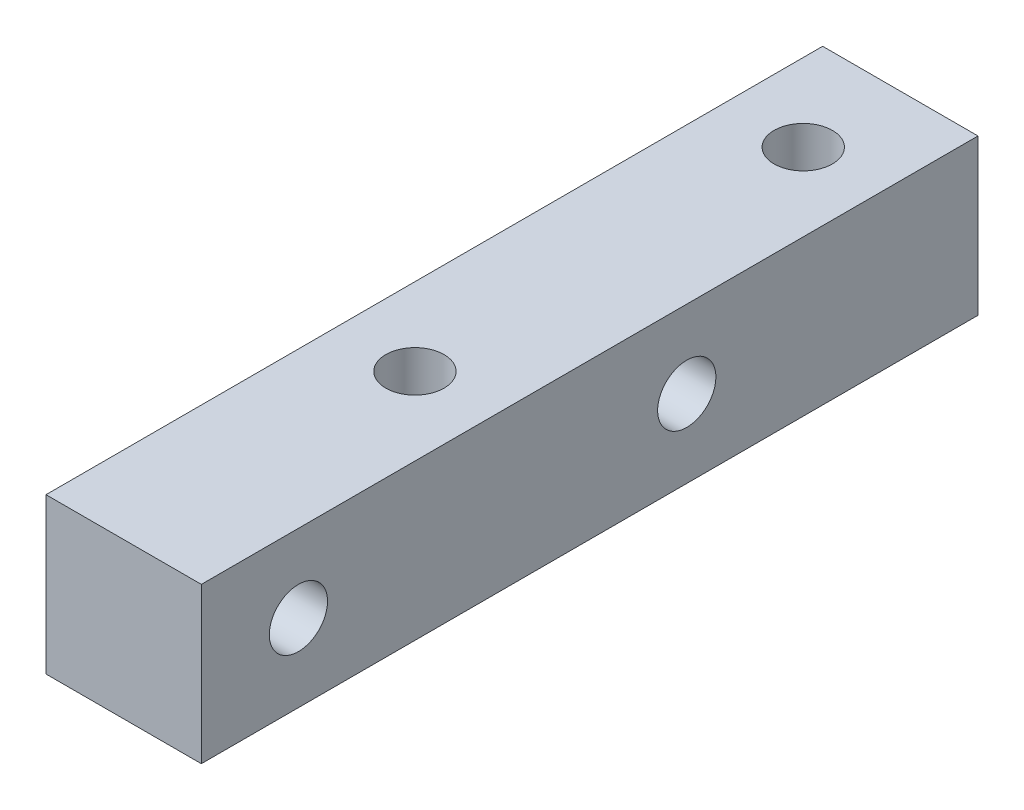
ISO-10303-21;
HEADER;
FILE_DESCRIPTION(('STEP AP214'),'2;1');
FILE_NAME('part.step','',(''),(''),'','','');
FILE_SCHEMA(('AUTOMOTIVE_DESIGN { 1 0 10303 214 1 1 1 1 }'));
ENDSEC;
DATA;
#1=APPLICATION_CONTEXT('core data for automotive mechanical design processes');
#2=APPLICATION_PROTOCOL_DEFINITION('international standard','automotive_design',2000,#1);
#3=PRODUCT_CONTEXT('',#1,'mechanical');
#4=PRODUCT('Part','Part','',(#3));
#5=PRODUCT_RELATED_PRODUCT_CATEGORY('part','',(#4));
#6=PRODUCT_DEFINITION_FORMATION('','',#4);
#7=PRODUCT_DEFINITION_CONTEXT('part definition',#1,'design');
#8=PRODUCT_DEFINITION('design','',#6,#7);
#9=PRODUCT_DEFINITION_SHAPE('','',#8);
#10=(LENGTH_UNIT() NAMED_UNIT(*) SI_UNIT(.MILLI.,.METRE.));
#11=(NAMED_UNIT(*) PLANE_ANGLE_UNIT() SI_UNIT($,.RADIAN.));
#12=(NAMED_UNIT(*) SI_UNIT($,.STERADIAN.) SOLID_ANGLE_UNIT());
#13=UNCERTAINTY_MEASURE_WITH_UNIT(LENGTH_MEASURE(1.E-05),#10,'distance_accuracy_value','');
#14=(GEOMETRIC_REPRESENTATION_CONTEXT(3) GLOBAL_UNCERTAINTY_ASSIGNED_CONTEXT((#13)) GLOBAL_UNIT_ASSIGNED_CONTEXT((#10,
#11,#12)) REPRESENTATION_CONTEXT('',''));
#15=CARTESIAN_POINT('',(0.,0.,0.));
#16=DIRECTION('',(0.,0.,1.));
#17=DIRECTION('',(1.,0.,0.));
#18=AXIS2_PLACEMENT_3D('',#15,#16,#17);
#19=CARTESIAN_POINT('',(4.,4.,20.));
#20=DIRECTION('',(-1.,0.,0.));
#21=DIRECTION('',(0.,-1.,0.));
#22=AXIS2_PLACEMENT_3D('',#19,#20,#21);
#23=PLANE('',#22);
#24=CARTESIAN_POINT('',(4.,0.,15.));
#25=DIRECTION('',(1.,0.,0.));
#26=DIRECTION('',(0.,1.,0.));
#27=AXIS2_PLACEMENT_3D('',#24,#25,#26);
#28=CIRCLE('',#27,1.5);
#29=CARTESIAN_POINT('',(4.,1.5,15.));
#30=VERTEX_POINT('',#29);
#31=EDGE_CURVE('E121',#30,#30,#28,.T.);
#32=ORIENTED_EDGE('',*,*,#31,.F.);
#33=EDGE_LOOP('',(#32));
#34=FACE_BOUND('',#33,.T.);
#35=CARTESIAN_POINT('',(4.,0.,-5.));
#36=DIRECTION('',(1.,0.,0.));
#37=DIRECTION('',(0.,1.,0.));
#38=AXIS2_PLACEMENT_3D('',#35,#36,#37);
#39=CIRCLE('',#38,1.5);
#40=CARTESIAN_POINT('',(4.,1.5,-5.));
#41=VERTEX_POINT('',#40);
#42=EDGE_CURVE('E122',#41,#41,#39,.T.);
#43=ORIENTED_EDGE('',*,*,#42,.F.);
#44=EDGE_LOOP('',(#43));
#45=FACE_BOUND('',#44,.T.);
#46=DIRECTION('',(0.,1.,0.));
#47=VECTOR('',#46,1.);
#48=CARTESIAN_POINT('',(4.,4.,-20.));
#49=LINE('',#48,#47);
#50=CARTESIAN_POINT('',(4.,-4.,-20.));
#51=VERTEX_POINT('',#50);
#52=CARTESIAN_POINT('',(4.,4.,-20.));
#53=VERTEX_POINT('',#52);
#54=EDGE_CURVE('E104',#51,#53,#49,.T.);
#55=ORIENTED_EDGE('',*,*,#54,.T.);
#56=DIRECTION('',(0.,0.,-1.));
#57=VECTOR('',#56,1.);
#58=CARTESIAN_POINT('',(4.,4.,20.));
#59=LINE('',#58,#57);
#60=CARTESIAN_POINT('',(4.,4.,20.));
#61=VERTEX_POINT('',#60);
#62=EDGE_CURVE('E11',#61,#53,#59,.T.);
#63=ORIENTED_EDGE('',*,*,#62,.F.);
#64=DIRECTION('',(0.,1.,0.));
#65=VECTOR('',#64,1.);
#66=CARTESIAN_POINT('',(4.,4.,20.));
#67=LINE('',#66,#65);
#68=CARTESIAN_POINT('',(4.,-4.,20.));
#69=VERTEX_POINT('',#68);
#70=EDGE_CURVE('E92',#69,#61,#67,.T.);
#71=ORIENTED_EDGE('',*,*,#70,.F.);
#72=DIRECTION('',(0.,0.,-1.));
#73=VECTOR('',#72,1.);
#74=CARTESIAN_POINT('',(4.,-4.,20.));
#75=LINE('',#74,#73);
#76=EDGE_CURVE('E100',#69,#51,#75,.T.);
#77=ORIENTED_EDGE('',*,*,#76,.T.);
#78=EDGE_LOOP('',(#55,#63,#71,#77));
#79=FACE_BOUND('',#78,.T.);
#80=ADVANCED_FACE('F41',(#34,#45,#79),#23,.F.);
#81=CARTESIAN_POINT('',(-4.,4.,20.));
#82=DIRECTION('',(0.,-1.,0.));
#83=DIRECTION('',(0.,0.,-1.));
#84=AXIS2_PLACEMENT_3D('',#81,#82,#83);
#85=PLANE('',#84);
#86=CARTESIAN_POINT('',(0.,4.,-15.));
#87=DIRECTION('',(0.,1.,0.));
#88=DIRECTION('',(0.,0.,1.));
#89=AXIS2_PLACEMENT_3D('',#86,#87,#88);
#90=CIRCLE('',#89,1.5);
#91=CARTESIAN_POINT('',(0.,4.,-13.5));
#92=VERTEX_POINT('',#91);
#93=EDGE_CURVE('E133',#92,#92,#90,.T.);
#94=ORIENTED_EDGE('',*,*,#93,.F.);
#95=EDGE_LOOP('',(#94));
#96=FACE_BOUND('',#95,.T.);
#97=CARTESIAN_POINT('',(0.,4.,5.));
#98=DIRECTION('',(0.,1.,0.));
#99=DIRECTION('',(0.,0.,1.));
#100=AXIS2_PLACEMENT_3D('',#97,#98,#99);
#101=CIRCLE('',#100,1.5);
#102=CARTESIAN_POINT('',(0.,4.,6.5));
#103=VERTEX_POINT('',#102);
#104=EDGE_CURVE('E134',#103,#103,#101,.T.);
#105=ORIENTED_EDGE('',*,*,#104,.F.);
#106=EDGE_LOOP('',(#105));
#107=FACE_BOUND('',#106,.T.);
#108=DIRECTION('',(-1.,0.,0.));
#109=VECTOR('',#108,1.);
#110=CARTESIAN_POINT('',(-4.,4.,-20.));
#111=LINE('',#110,#109);
#112=CARTESIAN_POINT('',(-4.,4.,-20.));
#113=VERTEX_POINT('',#112);
#114=EDGE_CURVE('E96',#53,#113,#111,.T.);
#115=ORIENTED_EDGE('',*,*,#114,.T.);
#116=DIRECTION('',(0.,0.,-1.));
#117=VECTOR('',#116,1.);
#118=CARTESIAN_POINT('',(-4.,4.,20.));
#119=LINE('',#118,#117);
#120=CARTESIAN_POINT('',(-4.,4.,20.));
#121=VERTEX_POINT('',#120);
#122=EDGE_CURVE('E49',#121,#113,#119,.T.);
#123=ORIENTED_EDGE('',*,*,#122,.F.);
#124=DIRECTION('',(-1.,0.,0.));
#125=VECTOR('',#124,1.);
#126=CARTESIAN_POINT('',(-4.,4.,20.));
#127=LINE('',#126,#125);
#128=EDGE_CURVE('E87',#61,#121,#127,.T.);
#129=ORIENTED_EDGE('',*,*,#128,.F.);
#130=ORIENTED_EDGE('',*,*,#62,.T.);
#131=EDGE_LOOP('',(#115,#123,#129,#130));
#132=FACE_BOUND('',#131,.T.);
#133=ADVANCED_FACE('F95',(#96,#107,#132),#85,.F.);
#134=CARTESIAN_POINT('',(-4.,4.,20.));
#135=DIRECTION('',(1.,0.,0.));
#136=DIRECTION('',(0.,1.,0.));
#137=AXIS2_PLACEMENT_3D('',#134,#135,#136);
#138=PLANE('',#137);
#139=CARTESIAN_POINT('',(-4.,0.,15.));
#140=DIRECTION('',(1.,0.,0.));
#141=DIRECTION('',(0.,1.,0.));
#142=AXIS2_PLACEMENT_3D('',#139,#140,#141);
#143=CIRCLE('',#142,1.5);
#144=CARTESIAN_POINT('',(-4.,1.5,15.));
#145=VERTEX_POINT('',#144);
#146=EDGE_CURVE('E107',#145,#145,#143,.F.);
#147=ORIENTED_EDGE('',*,*,#146,.F.);
#148=EDGE_LOOP('',(#147));
#149=FACE_BOUND('',#148,.T.);
#150=CARTESIAN_POINT('',(-4.,0.,-5.));
#151=DIRECTION('',(1.,0.,0.));
#152=DIRECTION('',(0.,1.,0.));
#153=AXIS2_PLACEMENT_3D('',#150,#151,#152);
#154=CIRCLE('',#153,1.5);
#155=CARTESIAN_POINT('',(-4.,1.5,-5.));
#156=VERTEX_POINT('',#155);
#157=EDGE_CURVE('E118',#156,#156,#154,.F.);
#158=ORIENTED_EDGE('',*,*,#157,.F.);
#159=EDGE_LOOP('',(#158));
#160=FACE_BOUND('',#159,.T.);
#161=DIRECTION('',(0.,-1.,0.));
#162=VECTOR('',#161,1.);
#163=CARTESIAN_POINT('',(-4.,4.,-20.));
#164=LINE('',#163,#162);
#165=CARTESIAN_POINT('',(-4.,-4.,-20.));
#166=VERTEX_POINT('',#165);
#167=EDGE_CURVE('E74',#113,#166,#164,.T.);
#168=ORIENTED_EDGE('',*,*,#167,.T.);
#169=DIRECTION('',(0.,0.,-1.));
#170=VECTOR('',#169,1.);
#171=CARTESIAN_POINT('',(-4.,-4.,20.));
#172=LINE('',#171,#170);
#173=CARTESIAN_POINT('',(-4.,-4.,20.));
#174=VERTEX_POINT('',#173);
#175=EDGE_CURVE('E97',#174,#166,#172,.T.);
#176=ORIENTED_EDGE('',*,*,#175,.F.);
#177=DIRECTION('',(0.,-1.,0.));
#178=VECTOR('',#177,1.);
#179=CARTESIAN_POINT('',(-4.,4.,20.));
#180=LINE('',#179,#178);
#181=EDGE_CURVE('E90',#121,#174,#180,.T.);
#182=ORIENTED_EDGE('',*,*,#181,.F.);
#183=ORIENTED_EDGE('',*,*,#122,.T.);
#184=EDGE_LOOP('',(#168,#176,#182,#183));
#185=FACE_BOUND('',#184,.T.);
#186=ADVANCED_FACE('F98',(#149,#160,#185),#138,.F.);
#187=CARTESIAN_POINT('',(-4.,-4.,20.));
#188=DIRECTION('',(0.,1.,0.));
#189=DIRECTION('',(0.,0.,1.));
#190=AXIS2_PLACEMENT_3D('',#187,#188,#189);
#191=PLANE('',#190);
#192=CARTESIAN_POINT('',(0.,-4.,-15.));
#193=DIRECTION('',(0.,1.,0.));
#194=DIRECTION('',(0.,0.,1.));
#195=AXIS2_PLACEMENT_3D('',#192,#193,#194);
#196=CIRCLE('',#195,1.5);
#197=CARTESIAN_POINT('',(0.,-4.,-13.5));
#198=VERTEX_POINT('',#197);
#199=EDGE_CURVE('E125',#198,#198,#196,.F.);
#200=ORIENTED_EDGE('',*,*,#199,.F.);
#201=EDGE_LOOP('',(#200));
#202=FACE_BOUND('',#201,.T.);
#203=CARTESIAN_POINT('',(0.,-4.,5.));
#204=DIRECTION('',(0.,1.,0.));
#205=DIRECTION('',(0.,0.,1.));
#206=AXIS2_PLACEMENT_3D('',#203,#204,#205);
#207=CIRCLE('',#206,1.5);
#208=CARTESIAN_POINT('',(0.,-4.,6.5));
#209=VERTEX_POINT('',#208);
#210=EDGE_CURVE('E130',#209,#209,#207,.F.);
#211=ORIENTED_EDGE('',*,*,#210,.F.);
#212=EDGE_LOOP('',(#211));
#213=FACE_BOUND('',#212,.T.);
#214=DIRECTION('',(1.,0.,0.));
#215=VECTOR('',#214,1.);
#216=CARTESIAN_POINT('',(-4.,-4.,-20.));
#217=LINE('',#216,#215);
#218=EDGE_CURVE('E80',#166,#51,#217,.T.);
#219=ORIENTED_EDGE('',*,*,#218,.T.);
#220=ORIENTED_EDGE('',*,*,#76,.F.);
#221=DIRECTION('',(1.,0.,0.));
#222=VECTOR('',#221,1.);
#223=CARTESIAN_POINT('',(-4.,-4.,20.));
#224=LINE('',#223,#222);
#225=EDGE_CURVE('E57',#174,#69,#224,.T.);
#226=ORIENTED_EDGE('',*,*,#225,.F.);
#227=ORIENTED_EDGE('',*,*,#175,.T.);
#228=EDGE_LOOP('',(#219,#220,#226,#227));
#229=FACE_BOUND('',#228,.T.);
#230=ADVANCED_FACE('F112',(#202,#213,#229),#191,.F.);
#231=CARTESIAN_POINT('',(0.,0.,20.));
#232=DIRECTION('',(0.,0.,1.));
#233=DIRECTION('',(1.,0.,0.));
#234=AXIS2_PLACEMENT_3D('',#231,#232,#233);
#235=PLANE('',#234);
#236=ORIENTED_EDGE('',*,*,#70,.T.);
#237=ORIENTED_EDGE('',*,*,#128,.T.);
#238=ORIENTED_EDGE('',*,*,#181,.T.);
#239=ORIENTED_EDGE('',*,*,#225,.T.);
#240=EDGE_LOOP('',(#236,#237,#238,#239));
#241=FACE_BOUND('',#240,.T.);
#242=ADVANCED_FACE('F88',(#241),#235,.T.);
#243=CARTESIAN_POINT('',(0.,0.,-20.));
#244=DIRECTION('',(0.,0.,1.));
#245=DIRECTION('',(1.,0.,0.));
#246=AXIS2_PLACEMENT_3D('',#243,#244,#245);
#247=PLANE('',#246);
#248=ORIENTED_EDGE('',*,*,#54,.F.);
#249=ORIENTED_EDGE('',*,*,#218,.F.);
#250=ORIENTED_EDGE('',*,*,#167,.F.);
#251=ORIENTED_EDGE('',*,*,#114,.F.);
#252=EDGE_LOOP('',(#248,#249,#250,#251));
#253=FACE_BOUND('',#252,.T.);
#254=ADVANCED_FACE('F115',(#253),#247,.F.);
#255=CARTESIAN_POINT('',(-4.001,0.,-5.));
#256=DIRECTION('',(1.,0.,0.));
#257=DIRECTION('',(0.,1.,0.));
#258=AXIS2_PLACEMENT_3D('',#255,#256,#257);
#259=CYLINDRICAL_SURFACE('',#258,1.5);
#260=ORIENTED_EDGE('',*,*,#42,.T.);
#261=EDGE_LOOP('',(#260));
#262=FACE_BOUND('',#261,.T.);
#263=ORIENTED_EDGE('',*,*,#157,.T.);
#264=EDGE_LOOP('',(#263));
#265=FACE_BOUND('',#264,.T.);
#266=ADVANCED_FACE('F177',(#262,#265),#259,.F.);
#267=CARTESIAN_POINT('',(-4.001,0.,15.));
#268=DIRECTION('',(1.,0.,0.));
#269=DIRECTION('',(0.,1.,0.));
#270=AXIS2_PLACEMENT_3D('',#267,#268,#269);
#271=CYLINDRICAL_SURFACE('',#270,1.5);
#272=ORIENTED_EDGE('',*,*,#31,.T.);
#273=EDGE_LOOP('',(#272));
#274=FACE_BOUND('',#273,.T.);
#275=ORIENTED_EDGE('',*,*,#146,.T.);
#276=EDGE_LOOP('',(#275));
#277=FACE_BOUND('',#276,.T.);
#278=ADVANCED_FACE('F152',(#274,#277),#271,.F.);
#279=CARTESIAN_POINT('',(0.,-4.001,5.));
#280=DIRECTION('',(0.,1.,0.));
#281=DIRECTION('',(0.,0.,1.));
#282=AXIS2_PLACEMENT_3D('',#279,#280,#281);
#283=CYLINDRICAL_SURFACE('',#282,1.5);
#284=ORIENTED_EDGE('',*,*,#104,.T.);
#285=EDGE_LOOP('',(#284));
#286=FACE_BOUND('',#285,.T.);
#287=ORIENTED_EDGE('',*,*,#210,.T.);
#288=EDGE_LOOP('',(#287));
#289=FACE_BOUND('',#288,.T.);
#290=ADVANCED_FACE('F149',(#286,#289),#283,.F.);
#291=CARTESIAN_POINT('',(0.,-4.001,-15.));
#292=DIRECTION('',(0.,1.,0.));
#293=DIRECTION('',(0.,0.,1.));
#294=AXIS2_PLACEMENT_3D('',#291,#292,#293);
#295=CYLINDRICAL_SURFACE('',#294,1.5);
#296=ORIENTED_EDGE('',*,*,#93,.T.);
#297=EDGE_LOOP('',(#296));
#298=FACE_BOUND('',#297,.T.);
#299=ORIENTED_EDGE('',*,*,#199,.T.);
#300=EDGE_LOOP('',(#299));
#301=FACE_BOUND('',#300,.T.);
#302=ADVANCED_FACE('F142',(#298,#301),#295,.F.);
#303=CLOSED_SHELL('',(#80,#133,#186,#230,#242,#254,#266,#278,#290,#302));
#304=MANIFOLD_SOLID_BREP('B2',#303);
#305=ADVANCED_BREP_SHAPE_REPRESENTATION('',(#18,#304),#14);
#306=SHAPE_DEFINITION_REPRESENTATION(#9,#305);
ENDSEC;
END-ISO-10303-21;
